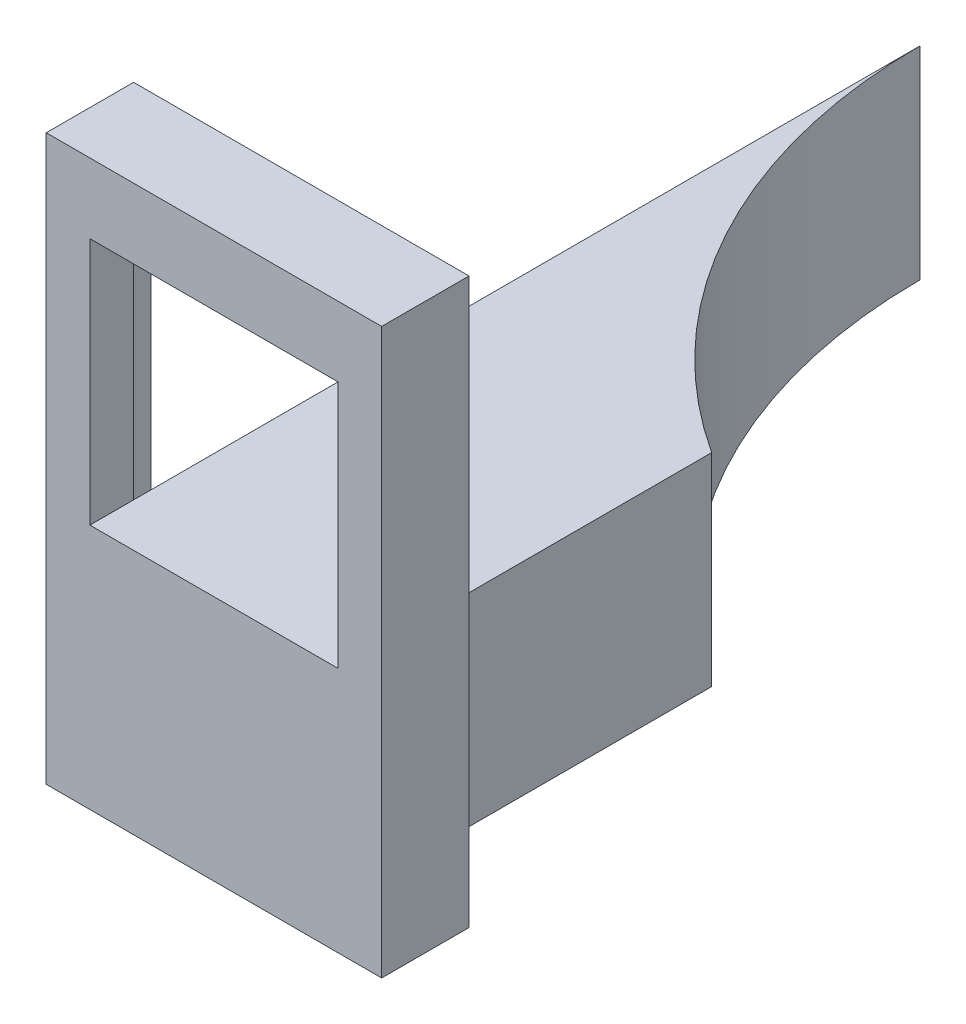
ISO-10303-21;
HEADER;
FILE_DESCRIPTION(('STEP AP214'),'2;1');
FILE_NAME('part.step','',(''),(''),'','','');
FILE_SCHEMA(('AUTOMOTIVE_DESIGN { 1 0 10303 214 1 1 1 1 }'));
ENDSEC;
DATA;
#1=APPLICATION_CONTEXT('core data for automotive mechanical design processes');
#2=APPLICATION_PROTOCOL_DEFINITION('international standard','automotive_design',2000,#1);
#3=PRODUCT_CONTEXT('',#1,'mechanical');
#4=PRODUCT('Part','Part','',(#3));
#5=PRODUCT_RELATED_PRODUCT_CATEGORY('part','',(#4));
#6=PRODUCT_DEFINITION_FORMATION('','',#4);
#7=PRODUCT_DEFINITION_CONTEXT('part definition',#1,'design');
#8=PRODUCT_DEFINITION('design','',#6,#7);
#9=PRODUCT_DEFINITION_SHAPE('','',#8);
#10=(LENGTH_UNIT() NAMED_UNIT(*) SI_UNIT(.MILLI.,.METRE.));
#11=(NAMED_UNIT(*) PLANE_ANGLE_UNIT() SI_UNIT($,.RADIAN.));
#12=(NAMED_UNIT(*) SI_UNIT($,.STERADIAN.) SOLID_ANGLE_UNIT());
#13=UNCERTAINTY_MEASURE_WITH_UNIT(LENGTH_MEASURE(1.E-05),#10,'distance_accuracy_value','');
#14=(GEOMETRIC_REPRESENTATION_CONTEXT(3) GLOBAL_UNCERTAINTY_ASSIGNED_CONTEXT((#13)) GLOBAL_UNIT_ASSIGNED_CONTEXT((#10,
#11,#12)) REPRESENTATION_CONTEXT('',''));
#15=CARTESIAN_POINT('',(0.,0.,0.));
#16=DIRECTION('',(0.,0.,1.));
#17=DIRECTION('',(1.,0.,0.));
#18=AXIS2_PLACEMENT_3D('',#15,#16,#17);
#19=CARTESIAN_POINT('',(0.,0.,-5.));
#20=DIRECTION('',(0.,0.,1.));
#21=DIRECTION('',(1.,0.,0.));
#22=AXIS2_PLACEMENT_3D('',#19,#20,#21);
#23=PLANE('',#22);
#24=DIRECTION('',(0.,1.,0.));
#25=VECTOR('',#24,1.);
#26=CARTESIAN_POINT('',(31.4,2.99999999999999,-5.));
#27=LINE('',#26,#25);
#28=CARTESIAN_POINT('',(31.4,2.99999999999999,-5.));
#29=VERTEX_POINT('',#28);
#30=CARTESIAN_POINT('',(31.4,26.2,-5.));
#31=VERTEX_POINT('',#30);
#32=EDGE_CURVE('E282',#29,#31,#27,.T.);
#33=ORIENTED_EDGE('',*,*,#32,.T.);
#34=CARTESIAN_POINT('',(31.4,54.6,-5.));
#35=VERTEX_POINT('',#34);
#36=EDGE_CURVE('E281',#31,#35,#27,.T.);
#37=ORIENTED_EDGE('',*,*,#36,.T.);
#38=DIRECTION('',(-1.,0.,0.));
#39=VECTOR('',#38,1.);
#40=CARTESIAN_POINT('',(31.4,54.6,-5.));
#41=LINE('',#40,#39);
#42=CARTESIAN_POINT('',(3.,54.6,-5.));
#43=VERTEX_POINT('',#42);
#44=EDGE_CURVE('E267',#35,#43,#41,.T.);
#45=ORIENTED_EDGE('',*,*,#44,.T.);
#46=DIRECTION('',(0.,-1.,0.));
#47=VECTOR('',#46,1.);
#48=CARTESIAN_POINT('',(3.,54.6,-5.));
#49=LINE('',#48,#47);
#50=CARTESIAN_POINT('',(3.,26.2,-5.));
#51=VERTEX_POINT('',#50);
#52=EDGE_CURVE('E273',#43,#51,#49,.T.);
#53=ORIENTED_EDGE('',*,*,#52,.T.);
#54=CARTESIAN_POINT('',(3.,2.99999999999999,-5.));
#55=VERTEX_POINT('',#54);
#56=EDGE_CURVE('E271',#51,#55,#49,.T.);
#57=ORIENTED_EDGE('',*,*,#56,.T.);
#58=DIRECTION('',(1.,0.,0.));
#59=VECTOR('',#58,1.);
#60=CARTESIAN_POINT('',(3.,2.99999999999999,-5.));
#61=LINE('',#60,#59);
#62=EDGE_CURVE('E277',#55,#29,#61,.T.);
#63=ORIENTED_EDGE('',*,*,#62,.T.);
#64=EDGE_LOOP('',(#33,#37,#45,#53,#57,#63));
#65=FACE_BOUND('',#64,.T.);
#66=DIRECTION('',(-1.,0.,0.));
#67=VECTOR('',#66,1.);
#68=CARTESIAN_POINT('',(34.4,60.6,-5.));
#69=LINE('',#68,#67);
#70=CARTESIAN_POINT('',(34.4,60.6,-5.));
#71=VERTEX_POINT('',#70);
#72=CARTESIAN_POINT('',(0.,60.6,-5.));
#73=VERTEX_POINT('',#72);
#74=EDGE_CURVE('E156',#71,#73,#69,.T.);
#75=ORIENTED_EDGE('',*,*,#74,.F.);
#76=DIRECTION('',(0.,1.,0.));
#77=VECTOR('',#76,1.);
#78=CARTESIAN_POINT('',(34.4,0.,-5.));
#79=LINE('',#78,#77);
#80=CARTESIAN_POINT('',(34.4,0.,-5.));
#81=VERTEX_POINT('',#80);
#82=EDGE_CURVE('E48',#81,#71,#79,.T.);
#83=ORIENTED_EDGE('',*,*,#82,.F.);
#84=DIRECTION('',(1.,0.,0.));
#85=VECTOR('',#84,1.);
#86=CARTESIAN_POINT('',(0.,0.,-5.));
#87=LINE('',#86,#85);
#88=CARTESIAN_POINT('',(0.,0.,-5.));
#89=VERTEX_POINT('',#88);
#90=EDGE_CURVE('E306',#89,#81,#87,.T.);
#91=ORIENTED_EDGE('',*,*,#90,.F.);
#92=DIRECTION('',(0.,-1.,0.));
#93=VECTOR('',#92,1.);
#94=CARTESIAN_POINT('',(0.,60.6,-5.));
#95=LINE('',#94,#93);
#96=EDGE_CURVE('E303',#73,#89,#95,.T.);
#97=ORIENTED_EDGE('',*,*,#96,.F.);
#98=EDGE_LOOP('',(#75,#83,#91,#97));
#99=FACE_BOUND('',#98,.T.);
#100=ADVANCED_FACE('F39',(#65,#99),#23,.F.);
#101=CARTESIAN_POINT('',(0.,0.,0.));
#102=DIRECTION('',(0.,0.,1.));
#103=DIRECTION('',(1.,0.,0.));
#104=AXIS2_PLACEMENT_3D('',#101,#102,#103);
#105=PLANE('',#104);
#106=DIRECTION('',(0.,1.,0.));
#107=VECTOR('',#106,1.);
#108=CARTESIAN_POINT('',(31.4,2.99999999999999,0.));
#109=LINE('',#108,#107);
#110=CARTESIAN_POINT('',(31.4,26.2,0.));
#111=VERTEX_POINT('',#110);
#112=CARTESIAN_POINT('',(31.4,54.6,0.));
#113=VERTEX_POINT('',#112);
#114=EDGE_CURVE('E272',#111,#113,#109,.T.);
#115=ORIENTED_EDGE('',*,*,#114,.F.);
#116=DIRECTION('',(-1.,0.,0.));
#117=VECTOR('',#116,1.);
#118=CARTESIAN_POINT('',(3.,26.2,0.));
#119=LINE('',#118,#117);
#120=CARTESIAN_POINT('',(3.,26.2,0.));
#121=VERTEX_POINT('',#120);
#122=EDGE_CURVE('E245',#111,#121,#119,.T.);
#123=ORIENTED_EDGE('',*,*,#122,.T.);
#124=DIRECTION('',(0.,-1.,0.));
#125=VECTOR('',#124,1.);
#126=CARTESIAN_POINT('',(3.,54.6,0.));
#127=LINE('',#126,#125);
#128=CARTESIAN_POINT('',(3.,54.6,0.));
#129=VERTEX_POINT('',#128);
#130=EDGE_CURVE('E289',#129,#121,#127,.T.);
#131=ORIENTED_EDGE('',*,*,#130,.F.);
#132=DIRECTION('',(-1.,0.,0.));
#133=VECTOR('',#132,1.);
#134=CARTESIAN_POINT('',(31.4,54.6,0.));
#135=LINE('',#134,#133);
#136=EDGE_CURVE('E258',#113,#129,#135,.T.);
#137=ORIENTED_EDGE('',*,*,#136,.F.);
#138=EDGE_LOOP('',(#115,#123,#131,#137));
#139=FACE_BOUND('',#138,.T.);
#140=DIRECTION('',(0.,-1.,0.));
#141=VECTOR('',#140,1.);
#142=CARTESIAN_POINT('',(-2.00000000000001,-2.,0.));
#143=LINE('',#142,#141);
#144=CARTESIAN_POINT('',(-2.00000000000001,62.6,0.));
#145=VERTEX_POINT('',#144);
#146=CARTESIAN_POINT('',(-2.00000000000001,-2.,0.));
#147=VERTEX_POINT('',#146);
#148=EDGE_CURVE('E186',#145,#147,#143,.T.);
#149=ORIENTED_EDGE('',*,*,#148,.T.);
#150=DIRECTION('',(1.,0.,0.));
#151=VECTOR('',#150,1.);
#152=CARTESIAN_POINT('',(-2.00000000000001,-2.,0.));
#153=LINE('',#152,#151);
#154=CARTESIAN_POINT('',(36.4,-2.,0.));
#155=VERTEX_POINT('',#154);
#156=EDGE_CURVE('E214',#147,#155,#153,.T.);
#157=ORIENTED_EDGE('',*,*,#156,.T.);
#158=DIRECTION('',(0.,1.,0.));
#159=VECTOR('',#158,1.);
#160=CARTESIAN_POINT('',(36.4,-2.,0.));
#161=LINE('',#160,#159);
#162=CARTESIAN_POINT('',(36.4,62.6,0.));
#163=VERTEX_POINT('',#162);
#164=EDGE_CURVE('E218',#155,#163,#161,.T.);
#165=ORIENTED_EDGE('',*,*,#164,.T.);
#166=DIRECTION('',(-1.,0.,0.));
#167=VECTOR('',#166,1.);
#168=CARTESIAN_POINT('',(-2.00000000000001,62.6,0.));
#169=LINE('',#168,#167);
#170=EDGE_CURVE('E198',#163,#145,#169,.T.);
#171=ORIENTED_EDGE('',*,*,#170,.T.);
#172=EDGE_LOOP('',(#149,#157,#165,#171));
#173=FACE_BOUND('',#172,.T.);
#174=ADVANCED_FACE('F41',(#139,#173),#105,.T.);
#175=CARTESIAN_POINT('',(31.4,54.6,-5.));
#176=DIRECTION('',(0.,1.,0.));
#177=DIRECTION('',(0.,0.,1.));
#178=AXIS2_PLACEMENT_3D('',#175,#176,#177);
#179=PLANE('',#178);
#180=ORIENTED_EDGE('',*,*,#136,.T.);
#181=DIRECTION('',(0.,0.,1.));
#182=VECTOR('',#181,1.);
#183=CARTESIAN_POINT('',(3.,54.6,-5.));
#184=LINE('',#183,#182);
#185=EDGE_CURVE('E286',#43,#129,#184,.T.);
#186=ORIENTED_EDGE('',*,*,#185,.F.);
#187=ORIENTED_EDGE('',*,*,#44,.F.);
#188=DIRECTION('',(0.,0.,1.));
#189=VECTOR('',#188,1.);
#190=CARTESIAN_POINT('',(31.4,54.6,-5.));
#191=LINE('',#190,#189);
#192=EDGE_CURVE('E294',#35,#113,#191,.T.);
#193=ORIENTED_EDGE('',*,*,#192,.T.);
#194=EDGE_LOOP('',(#180,#186,#187,#193));
#195=FACE_BOUND('',#194,.T.);
#196=ADVANCED_FACE('F330',(#195),#179,.F.);
#197=CARTESIAN_POINT('',(31.4,2.99999999999999,-5.));
#198=DIRECTION('',(1.,0.,0.));
#199=DIRECTION('',(0.,0.,-1.));
#200=AXIS2_PLACEMENT_3D('',#197,#198,#199);
#201=PLANE('',#200);
#202=ORIENTED_EDGE('',*,*,#36,.F.);
#203=DIRECTION('',(0.,0.,1.));
#204=VECTOR('',#203,1.);
#205=CARTESIAN_POINT('',(31.4,26.2,-95.));
#206=LINE('',#205,#204);
#207=EDGE_CURVE('E62',#31,#111,#206,.T.);
#208=ORIENTED_EDGE('',*,*,#207,.T.);
#209=ORIENTED_EDGE('',*,*,#114,.T.);
#210=ORIENTED_EDGE('',*,*,#192,.F.);
#211=EDGE_LOOP('',(#202,#208,#209,#210));
#212=FACE_BOUND('',#211,.T.);
#213=ADVANCED_FACE('F335',(#212),#201,.F.);
#214=CARTESIAN_POINT('',(3.,54.6,-5.));
#215=DIRECTION('',(-1.,0.,0.));
#216=DIRECTION('',(0.,-1.,0.));
#217=AXIS2_PLACEMENT_3D('',#214,#215,#216);
#218=PLANE('',#217);
#219=ORIENTED_EDGE('',*,*,#130,.T.);
#220=DIRECTION('',(0.,0.,-1.));
#221=VECTOR('',#220,1.);
#222=CARTESIAN_POINT('',(3.,26.2,-5.));
#223=LINE('',#222,#221);
#224=EDGE_CURVE('E11',#121,#51,#223,.T.);
#225=ORIENTED_EDGE('',*,*,#224,.T.);
#226=ORIENTED_EDGE('',*,*,#52,.F.);
#227=ORIENTED_EDGE('',*,*,#185,.T.);
#228=EDGE_LOOP('',(#219,#225,#226,#227));
#229=FACE_BOUND('',#228,.T.);
#230=ADVANCED_FACE('F337',(#229),#218,.F.);
#231=CARTESIAN_POINT('',(3.,2.99999999999999,-95.));
#232=DIRECTION('',(-1.,0.,0.));
#233=DIRECTION('',(0.,0.,1.));
#234=AXIS2_PLACEMENT_3D('',#231,#232,#233);
#235=PLANE('',#234);
#236=ORIENTED_EDGE('',*,*,#56,.F.);
#237=DIRECTION('',(0.,0.,1.));
#238=VECTOR('',#237,1.);
#239=CARTESIAN_POINT('',(3.,26.2,-95.));
#240=LINE('',#239,#238);
#241=CARTESIAN_POINT('',(3.00000000000001,26.2,-95.));
#242=VERTEX_POINT('',#241);
#243=EDGE_CURVE('E254',#242,#51,#240,.T.);
#244=ORIENTED_EDGE('',*,*,#243,.F.);
#245=DIRECTION('',(0.,-1.,0.));
#246=VECTOR('',#245,1.);
#247=CARTESIAN_POINT('',(3.,2.99999999999999,-95.));
#248=LINE('',#247,#246);
#249=CARTESIAN_POINT('',(3.,2.99999999999999,-95.));
#250=VERTEX_POINT('',#249);
#251=EDGE_CURVE('E246',#242,#250,#248,.T.);
#252=ORIENTED_EDGE('',*,*,#251,.T.);
#253=DIRECTION('',(0.,0.,1.));
#254=VECTOR('',#253,1.);
#255=CARTESIAN_POINT('',(3.,2.99999999999999,-95.));
#256=LINE('',#255,#254);
#257=EDGE_CURVE('E250',#250,#55,#256,.T.);
#258=ORIENTED_EDGE('',*,*,#257,.T.);
#259=EDGE_LOOP('',(#236,#244,#252,#258));
#260=FACE_BOUND('',#259,.T.);
#261=ADVANCED_FACE('F340',(#260),#235,.T.);
#262=CARTESIAN_POINT('',(31.4,2.99999999999999,-95.));
#263=DIRECTION('',(1.,0.,0.));
#264=DIRECTION('',(0.,0.,-1.));
#265=AXIS2_PLACEMENT_3D('',#262,#263,#264);
#266=PLANE('',#265);
#267=DIRECTION('',(0.,1.,0.));
#268=VECTOR('',#267,1.);
#269=CARTESIAN_POINT('',(31.4,-73.8,-42.7850596093417));
#270=LINE('',#269,#268);
#271=CARTESIAN_POINT('',(31.4,26.2,-42.7850596093417));
#272=VERTEX_POINT('',#271);
#273=CARTESIAN_POINT('',(31.4,2.99999999999999,-42.7850596093417));
#274=VERTEX_POINT('',#273);
#275=EDGE_CURVE('E242',#272,#274,#270,.F.);
#276=ORIENTED_EDGE('',*,*,#275,.F.);
#277=EDGE_CURVE('E55',#272,#31,#206,.T.);
#278=ORIENTED_EDGE('',*,*,#277,.T.);
#279=ORIENTED_EDGE('',*,*,#32,.F.);
#280=DIRECTION('',(0.,0.,1.));
#281=VECTOR('',#280,1.);
#282=CARTESIAN_POINT('',(31.4,2.99999999999999,-95.));
#283=LINE('',#282,#281);
#284=EDGE_CURVE('E261',#274,#29,#283,.T.);
#285=ORIENTED_EDGE('',*,*,#284,.F.);
#286=EDGE_LOOP('',(#276,#278,#279,#285));
#287=FACE_BOUND('',#286,.T.);
#288=ADVANCED_FACE('F346',(#287),#266,.T.);
#289=CARTESIAN_POINT('',(3.,2.99999999999999,-95.));
#290=DIRECTION('',(0.,-1.,0.));
#291=DIRECTION('',(0.,0.,-1.));
#292=AXIS2_PLACEMENT_3D('',#289,#290,#291);
#293=PLANE('',#292);
#294=CARTESIAN_POINT('',(65.2,2.99999999999999,-95.));
#295=DIRECTION('',(0.,-1.,0.));
#296=DIRECTION('',(0.,0.,-1.));
#297=AXIS2_PLACEMENT_3D('',#294,#295,#296);
#298=CIRCLE('',#297,62.2);
#299=EDGE_CURVE('E239',#274,#250,#298,.T.);
#300=ORIENTED_EDGE('',*,*,#299,.F.);
#301=ORIENTED_EDGE('',*,*,#284,.T.);
#302=ORIENTED_EDGE('',*,*,#62,.F.);
#303=ORIENTED_EDGE('',*,*,#257,.F.);
#304=EDGE_LOOP('',(#300,#301,#302,#303));
#305=FACE_BOUND('',#304,.T.);
#306=ADVANCED_FACE('F348',(#305),#293,.T.);
#307=CARTESIAN_POINT('',(3.,26.2,-95.));
#308=DIRECTION('',(0.,1.,0.));
#309=DIRECTION('',(0.,0.,1.));
#310=AXIS2_PLACEMENT_3D('',#307,#308,#309);
#311=PLANE('',#310);
#312=CARTESIAN_POINT('',(65.2,26.2,-95.));
#313=DIRECTION('',(0.,1.,0.));
#314=DIRECTION('',(0.,0.,1.));
#315=AXIS2_PLACEMENT_3D('',#312,#313,#314);
#316=CIRCLE('',#315,62.2);
#317=EDGE_CURVE('E228',#242,#272,#316,.T.);
#318=ORIENTED_EDGE('',*,*,#317,.F.);
#319=ORIENTED_EDGE('',*,*,#243,.T.);
#320=ORIENTED_EDGE('',*,*,#224,.F.);
#321=ORIENTED_EDGE('',*,*,#122,.F.);
#322=ORIENTED_EDGE('',*,*,#207,.F.);
#323=ORIENTED_EDGE('',*,*,#277,.F.);
#324=EDGE_LOOP('',(#318,#319,#320,#321,#322,#323));
#325=FACE_BOUND('',#324,.T.);
#326=ADVANCED_FACE('F351',(#325),#311,.T.);
#327=CARTESIAN_POINT('',(65.2,-73.8,-95.));
#328=DIRECTION('',(0.,1.,0.));
#329=DIRECTION('',(0.,0.,1.));
#330=AXIS2_PLACEMENT_3D('',#327,#328,#329);
#331=CYLINDRICAL_SURFACE('',#330,62.2);
#332=ORIENTED_EDGE('',*,*,#275,.T.);
#333=ORIENTED_EDGE('',*,*,#299,.T.);
#334=ORIENTED_EDGE('',*,*,#251,.F.);
#335=ORIENTED_EDGE('',*,*,#317,.T.);
#336=EDGE_LOOP('',(#332,#333,#334,#335));
#337=FACE_BOUND('',#336,.T.);
#338=ADVANCED_FACE('F357',(#337),#331,.F.);
#339=CARTESIAN_POINT('',(34.4,60.6,-10.));
#340=DIRECTION('',(0.,1.,0.));
#341=DIRECTION('',(-1.,0.,0.));
#342=AXIS2_PLACEMENT_3D('',#339,#340,#341);
#343=PLANE('',#342);
#344=DIRECTION('',(0.,0.,1.));
#345=VECTOR('',#344,1.);
#346=CARTESIAN_POINT('',(34.4,60.6,-10.));
#347=LINE('',#346,#345);
#348=CARTESIAN_POINT('',(34.4,60.6,-10.));
#349=VERTEX_POINT('',#348);
#350=EDGE_CURVE('E183',#349,#71,#347,.T.);
#351=ORIENTED_EDGE('',*,*,#350,.T.);
#352=ORIENTED_EDGE('',*,*,#74,.T.);
#353=DIRECTION('',(0.,0.,1.));
#354=VECTOR('',#353,1.);
#355=CARTESIAN_POINT('',(0.,60.6,-10.));
#356=LINE('',#355,#354);
#357=CARTESIAN_POINT('',(0.,60.6,-10.));
#358=VERTEX_POINT('',#357);
#359=EDGE_CURVE('E149',#358,#73,#356,.T.);
#360=ORIENTED_EDGE('',*,*,#359,.F.);
#361=DIRECTION('',(-1.,0.,0.));
#362=VECTOR('',#361,1.);
#363=CARTESIAN_POINT('',(34.4,60.6,-10.));
#364=LINE('',#363,#362);
#365=EDGE_CURVE('E154',#349,#358,#364,.T.);
#366=ORIENTED_EDGE('',*,*,#365,.F.);
#367=EDGE_LOOP('',(#351,#352,#360,#366));
#368=FACE_BOUND('',#367,.T.);
#369=ADVANCED_FACE('F152',(#368),#343,.F.);
#370=CARTESIAN_POINT('',(34.4,0.,-10.));
#371=DIRECTION('',(1.,0.,0.));
#372=DIRECTION('',(0.,0.,-1.));
#373=AXIS2_PLACEMENT_3D('',#370,#371,#372);
#374=PLANE('',#373);
#375=DIRECTION('',(0.,0.,1.));
#376=VECTOR('',#375,1.);
#377=CARTESIAN_POINT('',(34.4,0.,-10.));
#378=LINE('',#377,#376);
#379=CARTESIAN_POINT('',(34.4,0.,-10.));
#380=VERTEX_POINT('',#379);
#381=EDGE_CURVE('E187',#380,#81,#378,.T.);
#382=ORIENTED_EDGE('',*,*,#381,.T.);
#383=ORIENTED_EDGE('',*,*,#82,.T.);
#384=ORIENTED_EDGE('',*,*,#350,.F.);
#385=DIRECTION('',(0.,1.,0.));
#386=VECTOR('',#385,1.);
#387=CARTESIAN_POINT('',(34.4,0.,-10.));
#388=LINE('',#387,#386);
#389=EDGE_CURVE('E161',#380,#349,#388,.T.);
#390=ORIENTED_EDGE('',*,*,#389,.F.);
#391=EDGE_LOOP('',(#382,#383,#384,#390));
#392=FACE_BOUND('',#391,.T.);
#393=ADVANCED_FACE('F312',(#392),#374,.F.);
#394=CARTESIAN_POINT('',(0.,0.,-10.));
#395=DIRECTION('',(0.,-1.,0.));
#396=DIRECTION('',(1.,0.,0.));
#397=AXIS2_PLACEMENT_3D('',#394,#395,#396);
#398=PLANE('',#397);
#399=DIRECTION('',(0.,0.,1.));
#400=VECTOR('',#399,1.);
#401=CARTESIAN_POINT('',(0.,0.,-10.));
#402=LINE('',#401,#400);
#403=CARTESIAN_POINT('',(0.,0.,-10.));
#404=VERTEX_POINT('',#403);
#405=EDGE_CURVE('E160',#404,#89,#402,.T.);
#406=ORIENTED_EDGE('',*,*,#405,.T.);
#407=ORIENTED_EDGE('',*,*,#90,.T.);
#408=ORIENTED_EDGE('',*,*,#381,.F.);
#409=DIRECTION('',(1.,0.,0.));
#410=VECTOR('',#409,1.);
#411=CARTESIAN_POINT('',(0.,0.,-10.));
#412=LINE('',#411,#410);
#413=EDGE_CURVE('E171',#404,#380,#412,.T.);
#414=ORIENTED_EDGE('',*,*,#413,.F.);
#415=EDGE_LOOP('',(#406,#407,#408,#414));
#416=FACE_BOUND('',#415,.T.);
#417=ADVANCED_FACE('F315',(#416),#398,.F.);
#418=CARTESIAN_POINT('',(0.,60.6,-10.));
#419=DIRECTION('',(-1.,0.,0.));
#420=DIRECTION('',(0.,-1.,0.));
#421=AXIS2_PLACEMENT_3D('',#418,#419,#420);
#422=PLANE('',#421);
#423=ORIENTED_EDGE('',*,*,#359,.T.);
#424=ORIENTED_EDGE('',*,*,#96,.T.);
#425=ORIENTED_EDGE('',*,*,#405,.F.);
#426=DIRECTION('',(0.,-1.,0.));
#427=VECTOR('',#426,1.);
#428=CARTESIAN_POINT('',(0.,60.6,-10.));
#429=LINE('',#428,#427);
#430=EDGE_CURVE('E165',#358,#404,#429,.T.);
#431=ORIENTED_EDGE('',*,*,#430,.F.);
#432=EDGE_LOOP('',(#423,#424,#425,#431));
#433=FACE_BOUND('',#432,.T.);
#434=ADVANCED_FACE('F166',(#433),#422,.F.);
#435=CARTESIAN_POINT('',(-2.00000000000001,-2.,-10.));
#436=DIRECTION('',(-1.,0.,0.));
#437=DIRECTION('',(0.,0.,1.));
#438=AXIS2_PLACEMENT_3D('',#435,#436,#437);
#439=PLANE('',#438);
#440=ORIENTED_EDGE('',*,*,#148,.F.);
#441=DIRECTION('',(0.,0.,1.));
#442=VECTOR('',#441,1.);
#443=CARTESIAN_POINT('',(-2.00000000000001,62.6,-10.));
#444=LINE('',#443,#442);
#445=CARTESIAN_POINT('',(-2.00000000000001,62.6,-10.));
#446=VERTEX_POINT('',#445);
#447=EDGE_CURVE('E225',#446,#145,#444,.T.);
#448=ORIENTED_EDGE('',*,*,#447,.F.);
#449=DIRECTION('',(0.,-1.,0.));
#450=VECTOR('',#449,1.);
#451=CARTESIAN_POINT('',(-2.00000000000001,-2.,-10.));
#452=LINE('',#451,#450);
#453=CARTESIAN_POINT('',(-2.00000000000001,-2.,-10.));
#454=VERTEX_POINT('',#453);
#455=EDGE_CURVE('E193',#446,#454,#452,.T.);
#456=ORIENTED_EDGE('',*,*,#455,.T.);
#457=DIRECTION('',(0.,0.,1.));
#458=VECTOR('',#457,1.);
#459=CARTESIAN_POINT('',(-2.00000000000001,-2.,-10.));
#460=LINE('',#459,#458);
#461=EDGE_CURVE('E210',#454,#147,#460,.T.);
#462=ORIENTED_EDGE('',*,*,#461,.T.);
#463=EDGE_LOOP('',(#440,#448,#456,#462));
#464=FACE_BOUND('',#463,.T.);
#465=ADVANCED_FACE('F322',(#464),#439,.T.);
#466=CARTESIAN_POINT('',(-2.00000000000001,62.6,-10.));
#467=DIRECTION('',(0.,1.,0.));
#468=DIRECTION('',(0.,0.,1.));
#469=AXIS2_PLACEMENT_3D('',#466,#467,#468);
#470=PLANE('',#469);
#471=ORIENTED_EDGE('',*,*,#170,.F.);
#472=DIRECTION('',(0.,0.,1.));
#473=VECTOR('',#472,1.);
#474=CARTESIAN_POINT('',(36.4,62.6,-10.));
#475=LINE('',#474,#473);
#476=CARTESIAN_POINT('',(36.4,62.6,-10.));
#477=VERTEX_POINT('',#476);
#478=EDGE_CURVE('E229',#477,#163,#475,.T.);
#479=ORIENTED_EDGE('',*,*,#478,.F.);
#480=DIRECTION('',(-1.,0.,0.));
#481=VECTOR('',#480,1.);
#482=CARTESIAN_POINT('',(-2.00000000000001,62.6,-10.));
#483=LINE('',#482,#481);
#484=EDGE_CURVE('E206',#477,#446,#483,.T.);
#485=ORIENTED_EDGE('',*,*,#484,.T.);
#486=ORIENTED_EDGE('',*,*,#447,.T.);
#487=EDGE_LOOP('',(#471,#479,#485,#486));
#488=FACE_BOUND('',#487,.T.);
#489=ADVANCED_FACE('F364',(#488),#470,.T.);
#490=CARTESIAN_POINT('',(36.4,-2.,-10.));
#491=DIRECTION('',(1.,0.,0.));
#492=DIRECTION('',(0.,0.,-1.));
#493=AXIS2_PLACEMENT_3D('',#490,#491,#492);
#494=PLANE('',#493);
#495=ORIENTED_EDGE('',*,*,#164,.F.);
#496=DIRECTION('',(0.,0.,1.));
#497=VECTOR('',#496,1.);
#498=CARTESIAN_POINT('',(36.4,-2.,-10.));
#499=LINE('',#498,#497);
#500=CARTESIAN_POINT('',(36.4,-2.,-10.));
#501=VERTEX_POINT('',#500);
#502=EDGE_CURVE('E232',#501,#155,#499,.T.);
#503=ORIENTED_EDGE('',*,*,#502,.F.);
#504=DIRECTION('',(0.,1.,0.));
#505=VECTOR('',#504,1.);
#506=CARTESIAN_POINT('',(36.4,-2.,-10.));
#507=LINE('',#506,#505);
#508=EDGE_CURVE('E202',#501,#477,#507,.T.);
#509=ORIENTED_EDGE('',*,*,#508,.T.);
#510=ORIENTED_EDGE('',*,*,#478,.T.);
#511=EDGE_LOOP('',(#495,#503,#509,#510));
#512=FACE_BOUND('',#511,.T.);
#513=ADVANCED_FACE('F369',(#512),#494,.T.);
#514=CARTESIAN_POINT('',(-2.00000000000001,-2.,-10.));
#515=DIRECTION('',(0.,-1.,0.));
#516=DIRECTION('',(0.,0.,-1.));
#517=AXIS2_PLACEMENT_3D('',#514,#515,#516);
#518=PLANE('',#517);
#519=ORIENTED_EDGE('',*,*,#156,.F.);
#520=ORIENTED_EDGE('',*,*,#461,.F.);
#521=DIRECTION('',(1.,0.,0.));
#522=VECTOR('',#521,1.);
#523=CARTESIAN_POINT('',(-2.00000000000001,-2.,-10.));
#524=LINE('',#523,#522);
#525=EDGE_CURVE('E197',#454,#501,#524,.T.);
#526=ORIENTED_EDGE('',*,*,#525,.T.);
#527=ORIENTED_EDGE('',*,*,#502,.T.);
#528=EDGE_LOOP('',(#519,#520,#526,#527));
#529=FACE_BOUND('',#528,.T.);
#530=ADVANCED_FACE('F366',(#529),#518,.T.);
#531=CARTESIAN_POINT('',(0.,0.,-10.));
#532=DIRECTION('',(0.,0.,-1.));
#533=DIRECTION('',(-1.,0.,0.));
#534=AXIS2_PLACEMENT_3D('',#531,#532,#533);
#535=PLANE('',#534);
#536=ORIENTED_EDGE('',*,*,#365,.T.);
#537=ORIENTED_EDGE('',*,*,#430,.T.);
#538=ORIENTED_EDGE('',*,*,#413,.T.);
#539=ORIENTED_EDGE('',*,*,#389,.T.);
#540=EDGE_LOOP('',(#536,#537,#538,#539));
#541=FACE_BOUND('',#540,.T.);
#542=ORIENTED_EDGE('',*,*,#455,.F.);
#543=ORIENTED_EDGE('',*,*,#484,.F.);
#544=ORIENTED_EDGE('',*,*,#508,.F.);
#545=ORIENTED_EDGE('',*,*,#525,.F.);
#546=EDGE_LOOP('',(#542,#543,#544,#545));
#547=FACE_BOUND('',#546,.T.);
#548=ADVANCED_FACE('F173',(#541,#547),#535,.T.);
#549=CLOSED_SHELL('',(#100,#174,#196,#213,#230,#261,#288,#306,#326,#338,#369,#393,#417,#434,
#465,#489,#513,#530,#548));
#550=MANIFOLD_SOLID_BREP('B2',#549);
#551=ADVANCED_BREP_SHAPE_REPRESENTATION('',(#18,#550),#14);
#552=SHAPE_DEFINITION_REPRESENTATION(#9,#551);
ENDSEC;
END-ISO-10303-21;
